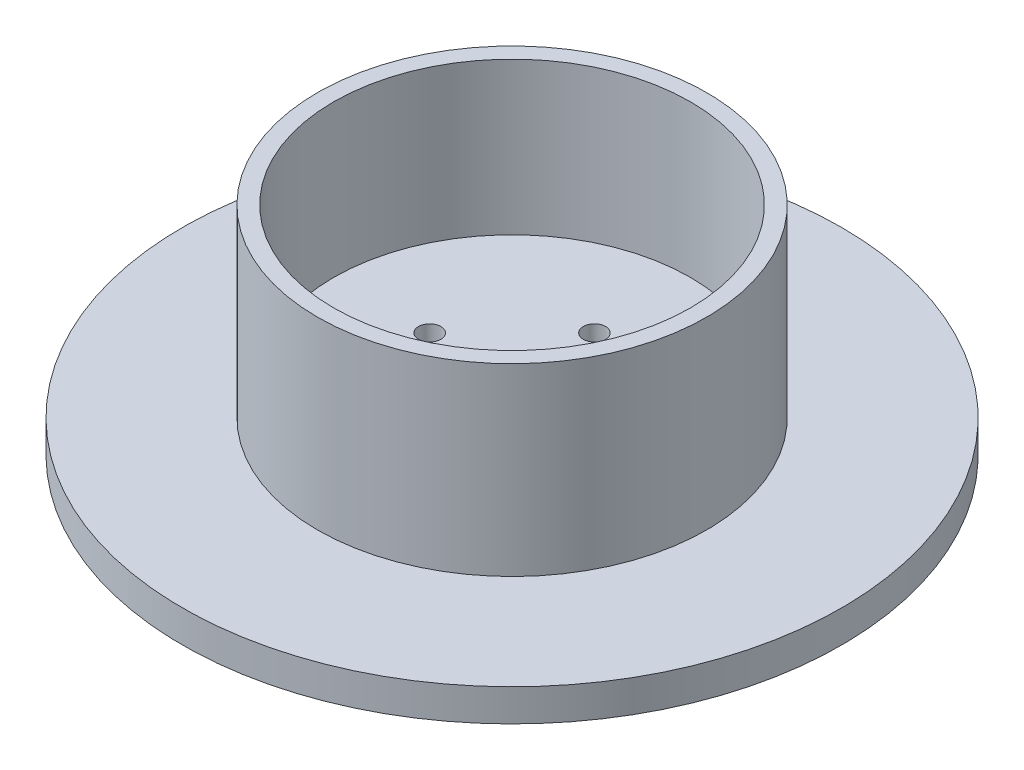
ISO-10303-21;
HEADER;
FILE_DESCRIPTION(('STEP AP214'),'2;1');
FILE_NAME('part.step','',(''),(''),'','','');
FILE_SCHEMA(('AUTOMOTIVE_DESIGN { 1 0 10303 214 1 1 1 1 }'));
ENDSEC;
DATA;
#1=APPLICATION_CONTEXT('core data for automotive mechanical design processes');
#2=APPLICATION_PROTOCOL_DEFINITION('international standard','automotive_design',2000,#1);
#3=PRODUCT_CONTEXT('',#1,'mechanical');
#4=PRODUCT('Part','Part','',(#3));
#5=PRODUCT_RELATED_PRODUCT_CATEGORY('part','',(#4));
#6=PRODUCT_DEFINITION_FORMATION('','',#4);
#7=PRODUCT_DEFINITION_CONTEXT('part definition',#1,'design');
#8=PRODUCT_DEFINITION('design','',#6,#7);
#9=PRODUCT_DEFINITION_SHAPE('','',#8);
#10=(LENGTH_UNIT() NAMED_UNIT(*) SI_UNIT(.MILLI.,.METRE.));
#11=(NAMED_UNIT(*) PLANE_ANGLE_UNIT() SI_UNIT($,.RADIAN.));
#12=(NAMED_UNIT(*) SI_UNIT($,.STERADIAN.) SOLID_ANGLE_UNIT());
#13=UNCERTAINTY_MEASURE_WITH_UNIT(LENGTH_MEASURE(1.E-05),#10,'distance_accuracy_value','');
#14=(GEOMETRIC_REPRESENTATION_CONTEXT(3) GLOBAL_UNCERTAINTY_ASSIGNED_CONTEXT((#13)) GLOBAL_UNIT_ASSIGNED_CONTEXT((#10,
#11,#12)) REPRESENTATION_CONTEXT('',''));
#15=CARTESIAN_POINT('',(0.,0.,0.));
#16=DIRECTION('',(0.,0.,1.));
#17=DIRECTION('',(1.,0.,0.));
#18=AXIS2_PLACEMENT_3D('',#15,#16,#17);
#19=CARTESIAN_POINT('',(0.,3.175,0.));
#20=DIRECTION('',(0.,-1.,0.));
#21=DIRECTION('',(0.,0.,-1.));
#22=AXIS2_PLACEMENT_3D('',#19,#20,#21);
#23=CYLINDRICAL_SURFACE('',#22,19.1875);
#24=CARTESIAN_POINT('',(0.,0.,0.));
#25=DIRECTION('',(0.,1.,0.));
#26=DIRECTION('',(0.,0.,1.));
#27=AXIS2_PLACEMENT_3D('',#24,#25,#26);
#28=CIRCLE('',#27,19.1875);
#29=CARTESIAN_POINT('',(0.,0.,19.1875));
#30=VERTEX_POINT('',#29);
#31=EDGE_CURVE('E60',#30,#30,#28,.T.);
#32=ORIENTED_EDGE('',*,*,#31,.T.);
#33=EDGE_LOOP('',(#32));
#34=FACE_BOUND('',#33,.T.);
#35=CARTESIAN_POINT('',(0.,18.175,0.));
#36=DIRECTION('',(0.,1.,0.));
#37=DIRECTION('',(0.,0.,1.));
#38=AXIS2_PLACEMENT_3D('',#35,#36,#37);
#39=CIRCLE('',#38,19.1875);
#40=CARTESIAN_POINT('',(0.,18.175,19.1875));
#41=VERTEX_POINT('',#40);
#42=EDGE_CURVE('E49',#41,#41,#39,.T.);
#43=ORIENTED_EDGE('',*,*,#42,.F.);
#44=EDGE_LOOP('',(#43));
#45=FACE_BOUND('',#44,.T.);
#46=ADVANCED_FACE('F41',(#34,#45),#23,.T.);
#47=CARTESIAN_POINT('',(0.,18.175,0.));
#48=DIRECTION('',(0.,1.,0.));
#49=DIRECTION('',(0.,0.,1.));
#50=AXIS2_PLACEMENT_3D('',#47,#48,#49);
#51=PLANE('',#50);
#52=ORIENTED_EDGE('',*,*,#42,.T.);
#53=EDGE_LOOP('',(#52));
#54=FACE_BOUND('',#53,.T.);
#55=CARTESIAN_POINT('',(0.,18.175,0.));
#56=DIRECTION('',(0.,1.,0.));
#57=DIRECTION('',(0.,0.,1.));
#58=AXIS2_PLACEMENT_3D('',#55,#56,#57);
#59=CIRCLE('',#58,17.6);
#60=CARTESIAN_POINT('',(0.,18.175,17.6));
#61=VERTEX_POINT('',#60);
#62=EDGE_CURVE('E56',#61,#61,#59,.T.);
#63=ORIENTED_EDGE('',*,*,#62,.F.);
#64=EDGE_LOOP('',(#63));
#65=FACE_BOUND('',#64,.T.);
#66=ADVANCED_FACE('F126',(#54,#65),#51,.T.);
#67=CARTESIAN_POINT('',(0.,18.175,0.));
#68=DIRECTION('',(0.,-1.,0.));
#69=DIRECTION('',(0.,0.,-1.));
#70=AXIS2_PLACEMENT_3D('',#67,#68,#69);
#71=CYLINDRICAL_SURFACE('',#70,17.6);
#72=ORIENTED_EDGE('',*,*,#62,.T.);
#73=EDGE_LOOP('',(#72));
#74=FACE_BOUND('',#73,.T.);
#75=CARTESIAN_POINT('',(0.,3.175,0.));
#76=DIRECTION('',(0.,1.,0.));
#77=DIRECTION('',(0.,0.,1.));
#78=AXIS2_PLACEMENT_3D('',#75,#76,#77);
#79=CIRCLE('',#78,17.6);
#80=CARTESIAN_POINT('',(0.,3.175,17.6));
#81=VERTEX_POINT('',#80);
#82=EDGE_CURVE('E10',#81,#81,#79,.F.);
#83=ORIENTED_EDGE('',*,*,#82,.T.);
#84=EDGE_LOOP('',(#83));
#85=FACE_BOUND('',#84,.T.);
#86=ADVANCED_FACE('F130',(#74,#85),#71,.F.);
#87=CARTESIAN_POINT('',(0.,3.175,0.));
#88=DIRECTION('',(0.,1.,0.));
#89=DIRECTION('',(0.,0.,1.));
#90=AXIS2_PLACEMENT_3D('',#87,#88,#89);
#91=PLANE('',#90);
#92=CARTESIAN_POINT('',(0.,3.175,8.125));
#93=DIRECTION('',(0.,1.,0.));
#94=DIRECTION('',(0.,0.,1.));
#95=AXIS2_PLACEMENT_3D('',#92,#93,#94);
#96=CIRCLE('',#95,1.1);
#97=CARTESIAN_POINT('',(0.,3.175,9.225));
#98=VERTEX_POINT('',#97);
#99=EDGE_CURVE('E44',#98,#98,#96,.T.);
#100=ORIENTED_EDGE('',*,*,#99,.F.);
#101=EDGE_LOOP('',(#100));
#102=FACE_BOUND('',#101,.T.);
#103=CARTESIAN_POINT('',(8.125,3.175,0.));
#104=DIRECTION('',(0.,1.,0.));
#105=DIRECTION('',(0.,0.,1.));
#106=AXIS2_PLACEMENT_3D('',#103,#104,#105);
#107=CIRCLE('',#106,1.1);
#108=CARTESIAN_POINT('',(8.125,3.175,1.1));
#109=VERTEX_POINT('',#108);
#110=EDGE_CURVE('E68',#109,#109,#107,.T.);
#111=ORIENTED_EDGE('',*,*,#110,.F.);
#112=EDGE_LOOP('',(#111));
#113=FACE_BOUND('',#112,.T.);
#114=CARTESIAN_POINT('',(-8.125,3.175,0.));
#115=DIRECTION('',(0.,1.,0.));
#116=DIRECTION('',(0.,0.,1.));
#117=AXIS2_PLACEMENT_3D('',#114,#115,#116);
#118=CIRCLE('',#117,1.1);
#119=CARTESIAN_POINT('',(-8.125,3.175,1.1));
#120=VERTEX_POINT('',#119);
#121=EDGE_CURVE('E65',#120,#120,#118,.T.);
#122=ORIENTED_EDGE('',*,*,#121,.F.);
#123=EDGE_LOOP('',(#122));
#124=FACE_BOUND('',#123,.T.);
#125=CARTESIAN_POINT('',(0.,3.175,-8.125));
#126=DIRECTION('',(0.,1.,0.));
#127=DIRECTION('',(0.,0.,1.));
#128=AXIS2_PLACEMENT_3D('',#125,#126,#127);
#129=CIRCLE('',#128,1.1);
#130=CARTESIAN_POINT('',(0.,3.175,-7.025));
#131=VERTEX_POINT('',#130);
#132=EDGE_CURVE('E61',#131,#131,#129,.T.);
#133=ORIENTED_EDGE('',*,*,#132,.F.);
#134=EDGE_LOOP('',(#133));
#135=FACE_BOUND('',#134,.T.);
#136=ORIENTED_EDGE('',*,*,#82,.F.);
#137=EDGE_LOOP('',(#136));
#138=FACE_BOUND('',#137,.T.);
#139=ADVANCED_FACE('F156',(#102,#113,#124,#135,#138),#91,.T.);
#140=CARTESIAN_POINT('',(0.,18.175,-8.125));
#141=DIRECTION('',(0.,-1.,0.));
#142=DIRECTION('',(0.,0.,-1.));
#143=AXIS2_PLACEMENT_3D('',#140,#141,#142);
#144=CYLINDRICAL_SURFACE('',#143,1.1);
#145=ORIENTED_EDGE('',*,*,#132,.T.);
#146=EDGE_LOOP('',(#145));
#147=FACE_BOUND('',#146,.T.);
#148=CARTESIAN_POINT('',(0.,-3.175,-8.125));
#149=DIRECTION('',(0.,-1.,0.));
#150=DIRECTION('',(0.,0.,-1.));
#151=AXIS2_PLACEMENT_3D('',#148,#149,#150);
#152=CIRCLE('',#151,1.1);
#153=CARTESIAN_POINT('',(0.,-3.175,-9.225));
#154=VERTEX_POINT('',#153);
#155=EDGE_CURVE('E92',#154,#154,#152,.T.);
#156=ORIENTED_EDGE('',*,*,#155,.T.);
#157=EDGE_LOOP('',(#156));
#158=FACE_BOUND('',#157,.T.);
#159=ADVANCED_FACE('F152',(#147,#158),#144,.F.);
#160=CARTESIAN_POINT('',(-8.125,18.175,0.));
#161=DIRECTION('',(0.,-1.,0.));
#162=DIRECTION('',(0.,0.,-1.));
#163=AXIS2_PLACEMENT_3D('',#160,#161,#162);
#164=CYLINDRICAL_SURFACE('',#163,1.1);
#165=ORIENTED_EDGE('',*,*,#121,.T.);
#166=EDGE_LOOP('',(#165));
#167=FACE_BOUND('',#166,.T.);
#168=CARTESIAN_POINT('',(-8.125,-3.175,0.));
#169=DIRECTION('',(0.,-1.,0.));
#170=DIRECTION('',(0.,0.,-1.));
#171=AXIS2_PLACEMENT_3D('',#168,#169,#170);
#172=CIRCLE('',#171,1.1);
#173=CARTESIAN_POINT('',(-8.125,-3.175,-1.1));
#174=VERTEX_POINT('',#173);
#175=EDGE_CURVE('E101',#174,#174,#172,.T.);
#176=ORIENTED_EDGE('',*,*,#175,.T.);
#177=EDGE_LOOP('',(#176));
#178=FACE_BOUND('',#177,.T.);
#179=ADVANCED_FACE('F149',(#167,#178),#164,.F.);
#180=CARTESIAN_POINT('',(8.125,18.175,0.));
#181=DIRECTION('',(0.,-1.,0.));
#182=DIRECTION('',(0.,0.,-1.));
#183=AXIS2_PLACEMENT_3D('',#180,#181,#182);
#184=CYLINDRICAL_SURFACE('',#183,1.1);
#185=ORIENTED_EDGE('',*,*,#110,.T.);
#186=EDGE_LOOP('',(#185));
#187=FACE_BOUND('',#186,.T.);
#188=CARTESIAN_POINT('',(8.125,-3.175,0.));
#189=DIRECTION('',(0.,-1.,0.));
#190=DIRECTION('',(0.,0.,-1.));
#191=AXIS2_PLACEMENT_3D('',#188,#189,#190);
#192=CIRCLE('',#191,1.1);
#193=CARTESIAN_POINT('',(8.125,-3.175,-1.1));
#194=VERTEX_POINT('',#193);
#195=EDGE_CURVE('E97',#194,#194,#192,.T.);
#196=ORIENTED_EDGE('',*,*,#195,.T.);
#197=EDGE_LOOP('',(#196));
#198=FACE_BOUND('',#197,.T.);
#199=ADVANCED_FACE('F121',(#187,#198),#184,.F.);
#200=CARTESIAN_POINT('',(0.,18.175,8.125));
#201=DIRECTION('',(0.,-1.,0.));
#202=DIRECTION('',(0.,0.,-1.));
#203=AXIS2_PLACEMENT_3D('',#200,#201,#202);
#204=CYLINDRICAL_SURFACE('',#203,1.1);
#205=ORIENTED_EDGE('',*,*,#99,.T.);
#206=EDGE_LOOP('',(#205));
#207=FACE_BOUND('',#206,.T.);
#208=CARTESIAN_POINT('',(0.,-3.175,8.125));
#209=DIRECTION('',(0.,-1.,0.));
#210=DIRECTION('',(0.,0.,-1.));
#211=AXIS2_PLACEMENT_3D('',#208,#209,#210);
#212=CIRCLE('',#211,1.1);
#213=CARTESIAN_POINT('',(0.,-3.175,7.025));
#214=VERTEX_POINT('',#213);
#215=EDGE_CURVE('E104',#214,#214,#212,.T.);
#216=ORIENTED_EDGE('',*,*,#215,.T.);
#217=EDGE_LOOP('',(#216));
#218=FACE_BOUND('',#217,.T.);
#219=ADVANCED_FACE('F108',(#207,#218),#204,.F.);
#220=CARTESIAN_POINT('',(0.,-3.175,0.));
#221=DIRECTION('',(0.,-1.,0.));
#222=DIRECTION('',(0.,0.,-1.));
#223=AXIS2_PLACEMENT_3D('',#220,#221,#222);
#224=PLANE('',#223);
#225=ORIENTED_EDGE('',*,*,#175,.F.);
#226=EDGE_LOOP('',(#225));
#227=FACE_BOUND('',#226,.T.);
#228=ORIENTED_EDGE('',*,*,#155,.F.);
#229=EDGE_LOOP('',(#228));
#230=FACE_BOUND('',#229,.T.);
#231=CARTESIAN_POINT('',(0.,-3.175,0.));
#232=DIRECTION('',(0.,-1.,0.));
#233=DIRECTION('',(0.,0.,-1.));
#234=AXIS2_PLACEMENT_3D('',#231,#232,#233);
#235=CIRCLE('',#234,32.5);
#236=CARTESIAN_POINT('',(0.,-3.175,-32.5));
#237=VERTEX_POINT('',#236);
#238=EDGE_CURVE('E91',#237,#237,#235,.T.);
#239=ORIENTED_EDGE('',*,*,#238,.T.);
#240=EDGE_LOOP('',(#239));
#241=FACE_BOUND('',#240,.T.);
#242=ORIENTED_EDGE('',*,*,#195,.F.);
#243=EDGE_LOOP('',(#242));
#244=FACE_BOUND('',#243,.T.);
#245=ORIENTED_EDGE('',*,*,#215,.F.);
#246=EDGE_LOOP('',(#245));
#247=FACE_BOUND('',#246,.T.);
#248=ADVANCED_FACE('F110',(#227,#230,#241,#244,#247),#224,.T.);
#249=CARTESIAN_POINT('',(0.,0.,0.));
#250=DIRECTION('',(0.,-1.,0.));
#251=DIRECTION('',(0.,0.,-1.));
#252=AXIS2_PLACEMENT_3D('',#249,#250,#251);
#253=PLANE('',#252);
#254=ORIENTED_EDGE('',*,*,#31,.F.);
#255=EDGE_LOOP('',(#254));
#256=FACE_BOUND('',#255,.T.);
#257=CARTESIAN_POINT('',(0.,0.,0.));
#258=DIRECTION('',(0.,-1.,0.));
#259=DIRECTION('',(0.,0.,-1.));
#260=AXIS2_PLACEMENT_3D('',#257,#258,#259);
#261=CIRCLE('',#260,32.5);
#262=CARTESIAN_POINT('',(0.,0.,-32.5));
#263=VERTEX_POINT('',#262);
#264=EDGE_CURVE('E87',#263,#263,#261,.T.);
#265=ORIENTED_EDGE('',*,*,#264,.F.);
#266=EDGE_LOOP('',(#265));
#267=FACE_BOUND('',#266,.T.);
#268=ADVANCED_FACE('F112',(#256,#267),#253,.F.);
#269=CARTESIAN_POINT('',(0.,-3.175,0.));
#270=DIRECTION('',(0.,1.,0.));
#271=DIRECTION('',(0.,0.,1.));
#272=AXIS2_PLACEMENT_3D('',#269,#270,#271);
#273=CYLINDRICAL_SURFACE('',#272,32.5);
#274=ORIENTED_EDGE('',*,*,#238,.F.);
#275=EDGE_LOOP('',(#274));
#276=FACE_BOUND('',#275,.T.);
#277=ORIENTED_EDGE('',*,*,#264,.T.);
#278=EDGE_LOOP('',(#277));
#279=FACE_BOUND('',#278,.T.);
#280=ADVANCED_FACE('F118',(#276,#279),#273,.T.);
#281=CLOSED_SHELL('',(#46,#66,#86,#139,#159,#179,#199,#219,#248,#268,#280));
#282=MANIFOLD_SOLID_BREP('B2',#281);
#283=ADVANCED_BREP_SHAPE_REPRESENTATION('',(#18,#282),#14);
#284=SHAPE_DEFINITION_REPRESENTATION(#9,#283);
ENDSEC;
END-ISO-10303-21;
